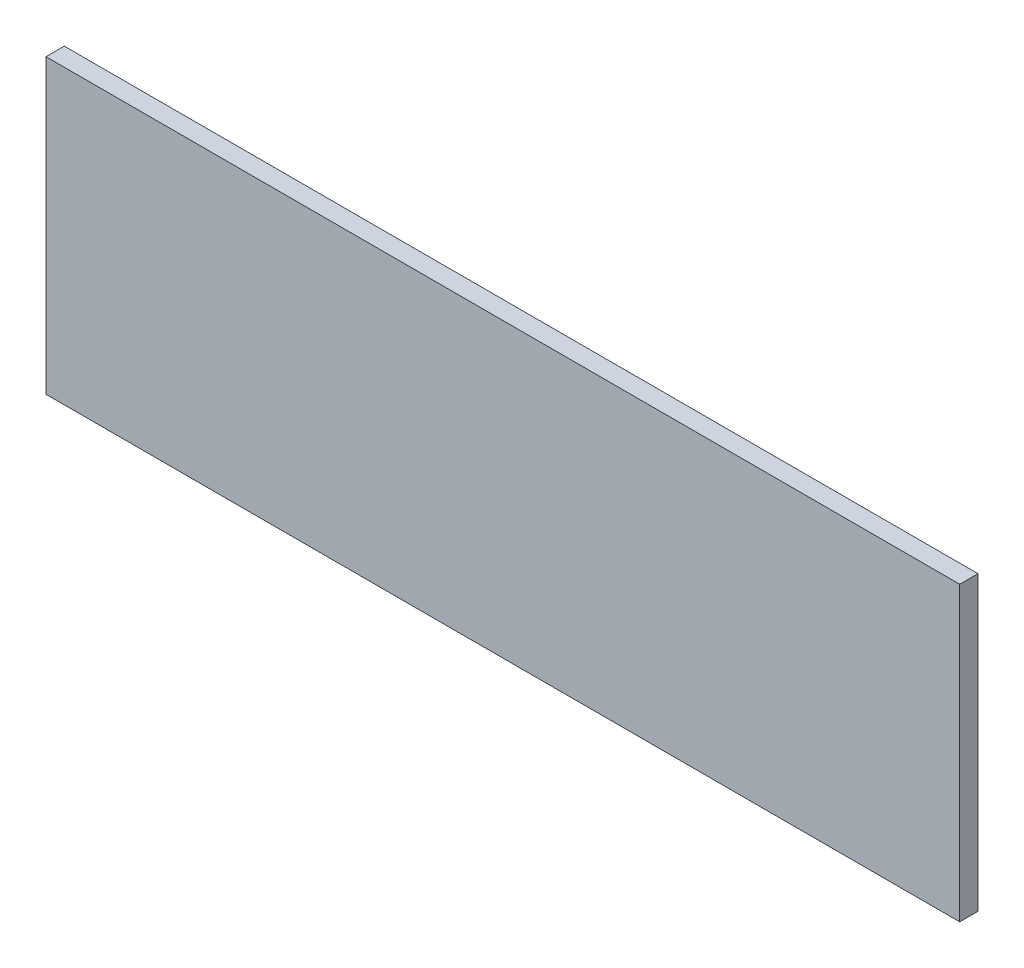
ISO-10303-21;
HEADER;
FILE_DESCRIPTION(('STEP AP214'),'2;1');
FILE_NAME('part.step','',(''),(''),'','','');
FILE_SCHEMA(('AUTOMOTIVE_DESIGN { 1 0 10303 214 1 1 1 1 }'));
ENDSEC;
DATA;
#1=APPLICATION_CONTEXT('core data for automotive mechanical design processes');
#2=APPLICATION_PROTOCOL_DEFINITION('international standard','automotive_design',2000,#1);
#3=PRODUCT_CONTEXT('',#1,'mechanical');
#4=PRODUCT('Part','Part','',(#3));
#5=PRODUCT_RELATED_PRODUCT_CATEGORY('part','',(#4));
#6=PRODUCT_DEFINITION_FORMATION('','',#4);
#7=PRODUCT_DEFINITION_CONTEXT('part definition',#1,'design');
#8=PRODUCT_DEFINITION('design','',#6,#7);
#9=PRODUCT_DEFINITION_SHAPE('','',#8);
#10=(LENGTH_UNIT() NAMED_UNIT(*) SI_UNIT(.MILLI.,.METRE.));
#11=(NAMED_UNIT(*) PLANE_ANGLE_UNIT() SI_UNIT($,.RADIAN.));
#12=(NAMED_UNIT(*) SI_UNIT($,.STERADIAN.) SOLID_ANGLE_UNIT());
#13=UNCERTAINTY_MEASURE_WITH_UNIT(LENGTH_MEASURE(1.E-05),#10,'distance_accuracy_value','');
#14=(GEOMETRIC_REPRESENTATION_CONTEXT(3) GLOBAL_UNCERTAINTY_ASSIGNED_CONTEXT((#13)) GLOBAL_UNIT_ASSIGNED_CONTEXT((#10,
#11,#12)) REPRESENTATION_CONTEXT('',''));
#15=CARTESIAN_POINT('',(0.,0.,0.));
#16=DIRECTION('',(0.,0.,1.));
#17=DIRECTION('',(1.,0.,0.));
#18=AXIS2_PLACEMENT_3D('',#15,#16,#17);
#19=CARTESIAN_POINT('',(-365.656565656566,-104.040404040404,20.));
#20=DIRECTION('',(1.,0.,0.));
#21=DIRECTION('',(0.,0.,-1.));
#22=AXIS2_PLACEMENT_3D('',#19,#20,#21);
#23=PLANE('',#22);
#24=DIRECTION('',(0.,-1.,0.));
#25=VECTOR('',#24,1.);
#26=CARTESIAN_POINT('',(-365.656565656566,-104.040404040404,0.));
#27=LINE('',#26,#25);
#28=CARTESIAN_POINT('',(-365.656565656566,215.959595959596,0.));
#29=VERTEX_POINT('',#28);
#30=CARTESIAN_POINT('',(-365.656565656566,-104.040404040404,0.));
#31=VERTEX_POINT('',#30);
#32=EDGE_CURVE('E107',#29,#31,#27,.T.);
#33=ORIENTED_EDGE('',*,*,#32,.T.);
#34=DIRECTION('',(0.,0.,-1.));
#35=VECTOR('',#34,1.);
#36=CARTESIAN_POINT('',(-365.656565656566,-104.040404040404,20.));
#37=LINE('',#36,#35);
#38=CARTESIAN_POINT('',(-365.656565656566,-104.040404040404,20.));
#39=VERTEX_POINT('',#38);
#40=EDGE_CURVE('E11',#39,#31,#37,.T.);
#41=ORIENTED_EDGE('',*,*,#40,.F.);
#42=DIRECTION('',(0.,-1.,0.));
#43=VECTOR('',#42,1.);
#44=CARTESIAN_POINT('',(-365.656565656566,-104.040404040404,20.));
#45=LINE('',#44,#43);
#46=CARTESIAN_POINT('',(-365.656565656566,215.959595959596,20.));
#47=VERTEX_POINT('',#46);
#48=EDGE_CURVE('E91',#47,#39,#45,.T.);
#49=ORIENTED_EDGE('',*,*,#48,.F.);
#50=DIRECTION('',(0.,0.,-1.));
#51=VECTOR('',#50,1.);
#52=CARTESIAN_POINT('',(-365.656565656566,215.959595959596,20.));
#53=LINE('',#52,#51);
#54=EDGE_CURVE('E103',#47,#29,#53,.T.);
#55=ORIENTED_EDGE('',*,*,#54,.T.);
#56=EDGE_LOOP('',(#33,#41,#49,#55));
#57=FACE_BOUND('',#56,.T.);
#58=ADVANCED_FACE('F39',(#57),#23,.F.);
#59=CARTESIAN_POINT('',(634.343434343434,-104.040404040404,20.));
#60=DIRECTION('',(0.,1.,0.));
#61=DIRECTION('',(0.,0.,1.));
#62=AXIS2_PLACEMENT_3D('',#59,#60,#61);
#63=PLANE('',#62);
#64=DIRECTION('',(1.,0.,0.));
#65=VECTOR('',#64,1.);
#66=CARTESIAN_POINT('',(634.343434343434,-104.040404040404,0.));
#67=LINE('',#66,#65);
#68=CARTESIAN_POINT('',(634.343434343434,-104.040404040404,0.));
#69=VERTEX_POINT('',#68);
#70=EDGE_CURVE('E96',#31,#69,#67,.T.);
#71=ORIENTED_EDGE('',*,*,#70,.T.);
#72=DIRECTION('',(0.,0.,-1.));
#73=VECTOR('',#72,1.);
#74=CARTESIAN_POINT('',(634.343434343434,-104.040404040404,20.));
#75=LINE('',#74,#73);
#76=CARTESIAN_POINT('',(634.343434343434,-104.040404040404,20.));
#77=VERTEX_POINT('',#76);
#78=EDGE_CURVE('E48',#77,#69,#75,.T.);
#79=ORIENTED_EDGE('',*,*,#78,.F.);
#80=DIRECTION('',(1.,0.,0.));
#81=VECTOR('',#80,1.);
#82=CARTESIAN_POINT('',(634.343434343434,-104.040404040404,20.));
#83=LINE('',#82,#81);
#84=EDGE_CURVE('E86',#39,#77,#83,.T.);
#85=ORIENTED_EDGE('',*,*,#84,.F.);
#86=ORIENTED_EDGE('',*,*,#40,.T.);
#87=EDGE_LOOP('',(#71,#79,#85,#86));
#88=FACE_BOUND('',#87,.T.);
#89=ADVANCED_FACE('F95',(#88),#63,.F.);
#90=CARTESIAN_POINT('',(634.343434343434,215.959595959596,20.));
#91=DIRECTION('',(-1.,0.,0.));
#92=DIRECTION('',(0.,0.,1.));
#93=AXIS2_PLACEMENT_3D('',#90,#91,#92);
#94=PLANE('',#93);
#95=DIRECTION('',(0.,1.,0.));
#96=VECTOR('',#95,1.);
#97=CARTESIAN_POINT('',(634.343434343434,215.959595959596,0.));
#98=LINE('',#97,#96);
#99=CARTESIAN_POINT('',(634.343434343434,215.959595959596,0.));
#100=VERTEX_POINT('',#99);
#101=EDGE_CURVE('E73',#69,#100,#98,.T.);
#102=ORIENTED_EDGE('',*,*,#101,.T.);
#103=DIRECTION('',(0.,0.,-1.));
#104=VECTOR('',#103,1.);
#105=CARTESIAN_POINT('',(634.343434343434,215.959595959596,20.));
#106=LINE('',#105,#104);
#107=CARTESIAN_POINT('',(634.343434343434,215.959595959596,20.));
#108=VERTEX_POINT('',#107);
#109=EDGE_CURVE('E98',#108,#100,#106,.T.);
#110=ORIENTED_EDGE('',*,*,#109,.F.);
#111=DIRECTION('',(0.,1.,0.));
#112=VECTOR('',#111,1.);
#113=CARTESIAN_POINT('',(634.343434343434,215.959595959596,20.));
#114=LINE('',#113,#112);
#115=EDGE_CURVE('E89',#77,#108,#114,.T.);
#116=ORIENTED_EDGE('',*,*,#115,.F.);
#117=ORIENTED_EDGE('',*,*,#78,.T.);
#118=EDGE_LOOP('',(#102,#110,#116,#117));
#119=FACE_BOUND('',#118,.T.);
#120=ADVANCED_FACE('F99',(#119),#94,.F.);
#121=CARTESIAN_POINT('',(-365.656565656566,215.959595959596,20.));
#122=DIRECTION('',(0.,-1.,0.));
#123=DIRECTION('',(0.,0.,-1.));
#124=AXIS2_PLACEMENT_3D('',#121,#122,#123);
#125=PLANE('',#124);
#126=DIRECTION('',(-1.,0.,0.));
#127=VECTOR('',#126,1.);
#128=CARTESIAN_POINT('',(-365.656565656566,215.959595959596,0.));
#129=LINE('',#128,#127);
#130=EDGE_CURVE('E79',#100,#29,#129,.T.);
#131=ORIENTED_EDGE('',*,*,#130,.T.);
#132=ORIENTED_EDGE('',*,*,#54,.F.);
#133=DIRECTION('',(-1.,0.,0.));
#134=VECTOR('',#133,1.);
#135=CARTESIAN_POINT('',(-365.656565656566,215.959595959596,20.));
#136=LINE('',#135,#134);
#137=EDGE_CURVE('E56',#108,#47,#136,.T.);
#138=ORIENTED_EDGE('',*,*,#137,.F.);
#139=ORIENTED_EDGE('',*,*,#109,.T.);
#140=EDGE_LOOP('',(#131,#132,#138,#139));
#141=FACE_BOUND('',#140,.T.);
#142=ADVANCED_FACE('F120',(#141),#125,.F.);
#143=CARTESIAN_POINT('',(0.,0.,20.));
#144=DIRECTION('',(0.,0.,-1.));
#145=DIRECTION('',(-1.,0.,0.));
#146=AXIS2_PLACEMENT_3D('',#143,#144,#145);
#147=PLANE('',#146);
#148=ORIENTED_EDGE('',*,*,#48,.T.);
#149=ORIENTED_EDGE('',*,*,#84,.T.);
#150=ORIENTED_EDGE('',*,*,#115,.T.);
#151=ORIENTED_EDGE('',*,*,#137,.T.);
#152=EDGE_LOOP('',(#148,#149,#150,#151));
#153=FACE_BOUND('',#152,.T.);
#154=ADVANCED_FACE('F87',(#153),#147,.F.);
#155=CARTESIAN_POINT('',(0.,0.,0.));
#156=DIRECTION('',(0.,0.,-1.));
#157=DIRECTION('',(-1.,0.,0.));
#158=AXIS2_PLACEMENT_3D('',#155,#156,#157);
#159=PLANE('',#158);
#160=ORIENTED_EDGE('',*,*,#32,.F.);
#161=ORIENTED_EDGE('',*,*,#130,.F.);
#162=ORIENTED_EDGE('',*,*,#101,.F.);
#163=ORIENTED_EDGE('',*,*,#70,.F.);
#164=EDGE_LOOP('',(#160,#161,#162,#163));
#165=FACE_BOUND('',#164,.T.);
#166=ADVANCED_FACE('F123',(#165),#159,.T.);
#167=CLOSED_SHELL('',(#58,#89,#120,#142,#154,#166));
#168=MANIFOLD_SOLID_BREP('B2',#167);
#169=ADVANCED_BREP_SHAPE_REPRESENTATION('',(#18,#168),#14);
#170=SHAPE_DEFINITION_REPRESENTATION(#9,#169);
ENDSEC;
END-ISO-10303-21;
